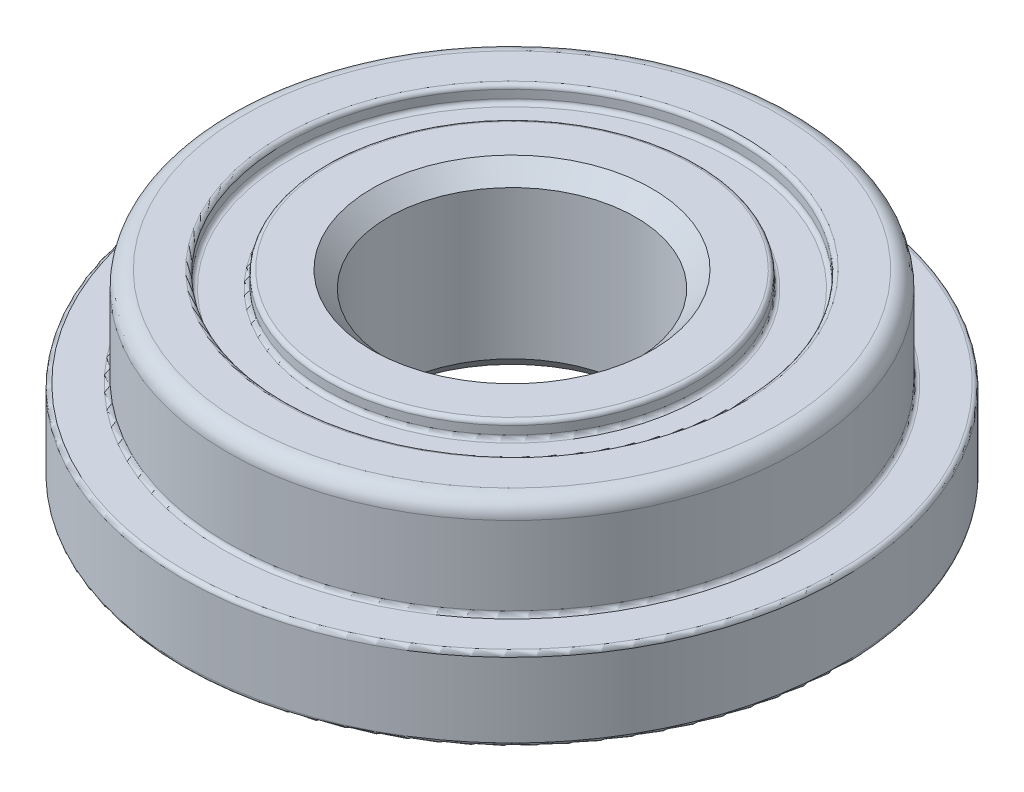
ISO-10303-21;
HEADER;
FILE_DESCRIPTION(('STEP AP214'),'2;1');
FILE_NAME('part.step','',(''),(''),'','','');
FILE_SCHEMA(('AUTOMOTIVE_DESIGN { 1 0 10303 214 1 1 1 1 }'));
ENDSEC;
DATA;
#1=APPLICATION_CONTEXT('core data for automotive mechanical design processes');
#2=APPLICATION_PROTOCOL_DEFINITION('international standard','automotive_design',2000,#1);
#3=PRODUCT_CONTEXT('',#1,'mechanical');
#4=PRODUCT('Part','Part','',(#3));
#5=PRODUCT_RELATED_PRODUCT_CATEGORY('part','',(#4));
#6=PRODUCT_DEFINITION_FORMATION('','',#4);
#7=PRODUCT_DEFINITION_CONTEXT('part definition',#1,'design');
#8=PRODUCT_DEFINITION('design','',#6,#7);
#9=PRODUCT_DEFINITION_SHAPE('','',#8);
#10=(LENGTH_UNIT() NAMED_UNIT(*) SI_UNIT(.MILLI.,.METRE.));
#11=(NAMED_UNIT(*) PLANE_ANGLE_UNIT() SI_UNIT($,.RADIAN.));
#12=(NAMED_UNIT(*) SI_UNIT($,.STERADIAN.) SOLID_ANGLE_UNIT());
#13=UNCERTAINTY_MEASURE_WITH_UNIT(LENGTH_MEASURE(1.E-05),#10,'distance_accuracy_value','');
#14=(GEOMETRIC_REPRESENTATION_CONTEXT(3) GLOBAL_UNCERTAINTY_ASSIGNED_CONTEXT((#13)) GLOBAL_UNIT_ASSIGNED_CONTEXT((#10,
#11,#12)) REPRESENTATION_CONTEXT('',''));
#15=CARTESIAN_POINT('',(0.,0.,0.));
#16=DIRECTION('',(0.,0.,1.));
#17=DIRECTION('',(1.,0.,0.));
#18=AXIS2_PLACEMENT_3D('',#15,#16,#17);
#19=CARTESIAN_POINT('',(0.,2.75,0.));
#20=DIRECTION('',(0.,1.,0.));
#21=DIRECTION('',(1.,0.,0.));
#22=AXIS2_PLACEMENT_3D('',#19,#20,#21);
#23=PLANE('',#22);
#24=CARTESIAN_POINT('',(0.,2.75,0.));
#25=DIRECTION('',(0.,-1.,0.));
#26=DIRECTION('',(0.,0.,1.));
#27=AXIS2_PLACEMENT_3D('',#24,#25,#26);
#28=CIRCLE('',#27,3.1625);
#29=CARTESIAN_POINT('',(0.,2.75,3.1625));
#30=VERTEX_POINT('',#29);
#31=EDGE_CURVE('E36',#30,#30,#28,.T.);
#32=ORIENTED_EDGE('',*,*,#31,.T.);
#33=EDGE_LOOP('',(#32));
#34=FACE_BOUND('',#33,.T.);
#35=CARTESIAN_POINT('',(0.,2.75,0.));
#36=DIRECTION('',(0.,1.,0.));
#37=DIRECTION('',(0.,0.,1.));
#38=AXIS2_PLACEMENT_3D('',#35,#36,#37);
#39=CIRCLE('',#38,3.7125);
#40=CARTESIAN_POINT('',(0.,2.75,3.7125));
#41=VERTEX_POINT('',#40);
#42=EDGE_CURVE('E110',#41,#41,#39,.T.);
#43=ORIENTED_EDGE('',*,*,#42,.T.);
#44=EDGE_LOOP('',(#43));
#45=FACE_BOUND('',#44,.T.);
#46=ADVANCED_FACE('F15',(#34,#45),#23,.T.);
#47=CARTESIAN_POINT('',(0.,3.025,0.));
#48=DIRECTION('',(0.,1.,0.));
#49=DIRECTION('',(1.,0.,0.));
#50=AXIS2_PLACEMENT_3D('',#47,#48,#49);
#51=PLANE('',#50);
#52=CARTESIAN_POINT('',(0.,3.025,0.));
#53=DIRECTION('',(0.,-1.,0.));
#54=DIRECTION('',(0.,0.,1.));
#55=AXIS2_PLACEMENT_3D('',#52,#53,#54);
#56=CIRCLE('',#55,3.85);
#57=CARTESIAN_POINT('',(0.,3.025,3.85));
#58=VERTEX_POINT('',#57);
#59=EDGE_CURVE('E96',#58,#58,#56,.T.);
#60=ORIENTED_EDGE('',*,*,#59,.T.);
#61=EDGE_LOOP('',(#60));
#62=FACE_BOUND('',#61,.T.);
#63=CARTESIAN_POINT('',(0.,3.025,0.));
#64=DIRECTION('',(0.,1.,0.));
#65=DIRECTION('',(0.,0.,1.));
#66=AXIS2_PLACEMENT_3D('',#63,#64,#65);
#67=CIRCLE('',#66,4.46875);
#68=CARTESIAN_POINT('',(0.,3.025,4.46875));
#69=VERTEX_POINT('',#68);
#70=EDGE_CURVE('E10',#69,#69,#67,.T.);
#71=ORIENTED_EDGE('',*,*,#70,.T.);
#72=EDGE_LOOP('',(#71));
#73=FACE_BOUND('',#72,.T.);
#74=ADVANCED_FACE('F17',(#62,#73),#51,.T.);
#75=CARTESIAN_POINT('',(0.,0.,0.));
#76=DIRECTION('',(0.,1.,0.));
#77=DIRECTION('',(1.,0.,0.));
#78=AXIS2_PLACEMENT_3D('',#75,#76,#77);
#79=PLANE('',#78);
#80=CARTESIAN_POINT('',(0.,0.,0.));
#81=DIRECTION('',(0.,1.,0.));
#82=DIRECTION('',(0.,0.,1.));
#83=AXIS2_PLACEMENT_3D('',#80,#81,#82);
#84=CIRCLE('',#83,2.3375);
#85=CARTESIAN_POINT('',(0.,0.,2.3375));
#86=VERTEX_POINT('',#85);
#87=EDGE_CURVE('E47',#86,#86,#84,.T.);
#88=ORIENTED_EDGE('',*,*,#87,.T.);
#89=EDGE_LOOP('',(#88));
#90=FACE_BOUND('',#89,.T.);
#91=CARTESIAN_POINT('',(0.,0.,0.));
#92=DIRECTION('',(0.,-1.,0.));
#93=DIRECTION('',(0.,0.,1.));
#94=AXIS2_PLACEMENT_3D('',#91,#92,#93);
#95=CIRCLE('',#94,5.43125);
#96=CARTESIAN_POINT('',(0.,0.,5.43125));
#97=VERTEX_POINT('',#96);
#98=EDGE_CURVE('E136',#97,#97,#95,.T.);
#99=ORIENTED_EDGE('',*,*,#98,.T.);
#100=EDGE_LOOP('',(#99));
#101=FACE_BOUND('',#100,.T.);
#102=ADVANCED_FACE('F143',(#90,#101),#79,.F.);
#103=CARTESIAN_POINT('',(0.,1.375,0.));
#104=DIRECTION('',(0.,1.,0.));
#105=DIRECTION('',(1.,0.,0.));
#106=AXIS2_PLACEMENT_3D('',#103,#104,#105);
#107=PLANE('',#106);
#108=CARTESIAN_POINT('',(0.,1.375,0.));
#109=DIRECTION('',(0.,-1.,0.));
#110=DIRECTION('',(0.,0.,1.));
#111=AXIS2_PLACEMENT_3D('',#108,#109,#110);
#112=CIRCLE('',#111,4.8125);
#113=CARTESIAN_POINT('',(0.,1.375,4.8125));
#114=VERTEX_POINT('',#113);
#115=EDGE_CURVE('E117',#114,#114,#112,.T.);
#116=ORIENTED_EDGE('',*,*,#115,.T.);
#117=EDGE_LOOP('',(#116));
#118=FACE_BOUND('',#117,.T.);
#119=CARTESIAN_POINT('',(0.,1.375,0.));
#120=DIRECTION('',(0.,1.,0.));
#121=DIRECTION('',(0.,0.,1.));
#122=AXIS2_PLACEMENT_3D('',#119,#120,#121);
#123=CIRCLE('',#122,5.43125);
#124=CARTESIAN_POINT('',(0.,1.375,5.43125));
#125=VERTEX_POINT('',#124);
#126=EDGE_CURVE('E116',#125,#125,#123,.T.);
#127=ORIENTED_EDGE('',*,*,#126,.T.);
#128=EDGE_LOOP('',(#127));
#129=FACE_BOUND('',#128,.T.);
#130=ADVANCED_FACE('F175',(#118,#129),#107,.T.);
#131=CARTESIAN_POINT('',(0.,3.025,0.));
#132=DIRECTION('',(0.,1.,0.));
#133=DIRECTION('',(1.,0.,0.));
#134=AXIS2_PLACEMENT_3D('',#131,#132,#133);
#135=PLANE('',#134);
#136=CARTESIAN_POINT('',(0.,3.025,0.));
#137=DIRECTION('',(0.,-1.,0.));
#138=DIRECTION('',(0.,0.,1.));
#139=AXIS2_PLACEMENT_3D('',#136,#137,#138);
#140=CIRCLE('',#139,2.3375);
#141=CARTESIAN_POINT('',(0.,3.025,2.3375));
#142=VERTEX_POINT('',#141);
#143=EDGE_CURVE('E33',#142,#142,#140,.T.);
#144=ORIENTED_EDGE('',*,*,#143,.T.);
#145=EDGE_LOOP('',(#144));
#146=FACE_BOUND('',#145,.T.);
#147=CARTESIAN_POINT('',(0.,3.025,0.));
#148=DIRECTION('',(0.,1.,0.));
#149=DIRECTION('',(0.,0.,1.));
#150=AXIS2_PLACEMENT_3D('',#147,#148,#149);
#151=CIRCLE('',#150,3.025);
#152=CARTESIAN_POINT('',(0.,3.025,3.025));
#153=VERTEX_POINT('',#152);
#154=EDGE_CURVE('E42',#153,#153,#151,.T.);
#155=ORIENTED_EDGE('',*,*,#154,.T.);
#156=EDGE_LOOP('',(#155));
#157=FACE_BOUND('',#156,.T.);
#158=ADVANCED_FACE('F60',(#146,#157),#135,.T.);
#159=CARTESIAN_POINT('',(0.,1.375,0.));
#160=DIRECTION('',(0.,-1.,0.));
#161=DIRECTION('',(0.,0.,-1.));
#162=AXIS2_PLACEMENT_3D('',#159,#160,#161);
#163=CYLINDRICAL_SURFACE('',#162,5.5);
#164=CARTESIAN_POINT('',(0.,0.06875,0.));
#165=DIRECTION('',(0.,1.,0.));
#166=DIRECTION('',(0.,0.,1.));
#167=AXIS2_PLACEMENT_3D('',#164,#165,#166);
#168=CIRCLE('',#167,5.5);
#169=CARTESIAN_POINT('',(0.,0.06875,5.5));
#170=VERTEX_POINT('',#169);
#171=EDGE_CURVE('E132',#170,#170,#168,.T.);
#172=ORIENTED_EDGE('',*,*,#171,.T.);
#173=EDGE_LOOP('',(#172));
#174=FACE_BOUND('',#173,.T.);
#175=CARTESIAN_POINT('',(0.,1.30625,0.));
#176=DIRECTION('',(0.,-1.,0.));
#177=DIRECTION('',(0.,0.,1.));
#178=AXIS2_PLACEMENT_3D('',#175,#176,#177);
#179=CIRCLE('',#178,5.5);
#180=CARTESIAN_POINT('',(0.,1.30625,5.5));
#181=VERTEX_POINT('',#180);
#182=EDGE_CURVE('E121',#181,#181,#179,.T.);
#183=ORIENTED_EDGE('',*,*,#182,.T.);
#184=EDGE_LOOP('',(#183));
#185=FACE_BOUND('',#184,.T.);
#186=ADVANCED_FACE('F171',(#174,#185),#163,.T.);
#187=CARTESIAN_POINT('',(0.,3.025,0.));
#188=DIRECTION('',(0.,-1.,0.));
#189=DIRECTION('',(0.,0.,-1.));
#190=AXIS2_PLACEMENT_3D('',#187,#188,#189);
#191=CYLINDRICAL_SURFACE('',#190,4.74375);
#192=CARTESIAN_POINT('',(0.,1.44375,0.));
#193=DIRECTION('',(0.,1.,0.));
#194=DIRECTION('',(0.,0.,1.));
#195=AXIS2_PLACEMENT_3D('',#192,#193,#194);
#196=CIRCLE('',#195,4.74375);
#197=CARTESIAN_POINT('',(0.,1.44375,4.74375));
#198=VERTEX_POINT('',#197);
#199=EDGE_CURVE('E122',#198,#198,#196,.T.);
#200=ORIENTED_EDGE('',*,*,#199,.T.);
#201=EDGE_LOOP('',(#200));
#202=FACE_BOUND('',#201,.T.);
#203=CARTESIAN_POINT('',(0.,2.75,0.));
#204=DIRECTION('',(0.,-1.,0.));
#205=DIRECTION('',(0.,0.,1.));
#206=AXIS2_PLACEMENT_3D('',#203,#204,#205);
#207=CIRCLE('',#206,4.74375);
#208=CARTESIAN_POINT('',(0.,2.75,4.74375));
#209=VERTEX_POINT('',#208);
#210=EDGE_CURVE('E19',#209,#209,#207,.T.);
#211=ORIENTED_EDGE('',*,*,#210,.T.);
#212=EDGE_LOOP('',(#211));
#213=FACE_BOUND('',#212,.T.);
#214=ADVANCED_FACE('F168',(#202,#213),#191,.T.);
#215=CARTESIAN_POINT('',(0.,2.75,0.));
#216=DIRECTION('',(0.,1.,0.));
#217=DIRECTION('',(0.,0.,1.));
#218=AXIS2_PLACEMENT_3D('',#215,#216,#217);
#219=TOROIDAL_SURFACE('',#218,4.46875,0.275);
#220=ORIENTED_EDGE('',*,*,#70,.F.);
#221=EDGE_LOOP('',(#220));
#222=FACE_BOUND('',#221,.T.);
#223=ORIENTED_EDGE('',*,*,#210,.F.);
#224=EDGE_LOOP('',(#223));
#225=FACE_BOUND('',#224,.T.);
#226=ADVANCED_FACE('F73',(#222,#225),#219,.T.);
#227=CARTESIAN_POINT('',(0.,0.,0.));
#228=DIRECTION('',(0.,1.,0.));
#229=DIRECTION('',(0.,0.,1.));
#230=AXIS2_PLACEMENT_3D('',#227,#228,#229);
#231=CYLINDRICAL_SURFACE('',#230,2.0625);
#232=CARTESIAN_POINT('',(0.,2.75,0.));
#233=DIRECTION('',(0.,1.,0.));
#234=DIRECTION('',(0.,0.,1.));
#235=AXIS2_PLACEMENT_3D('',#232,#233,#234);
#236=CIRCLE('',#235,2.0625);
#237=CARTESIAN_POINT('',(0.,2.75,2.0625));
#238=VERTEX_POINT('',#237);
#239=EDGE_CURVE('E51',#238,#238,#236,.T.);
#240=ORIENTED_EDGE('',*,*,#239,.T.);
#241=EDGE_LOOP('',(#240));
#242=FACE_BOUND('',#241,.T.);
#243=CARTESIAN_POINT('',(0.,0.275,0.));
#244=DIRECTION('',(0.,-1.,0.));
#245=DIRECTION('',(0.,0.,1.));
#246=AXIS2_PLACEMENT_3D('',#243,#244,#245);
#247=CIRCLE('',#246,2.0625);
#248=CARTESIAN_POINT('',(0.,0.275,2.0625));
#249=VERTEX_POINT('',#248);
#250=EDGE_CURVE('E46',#249,#249,#247,.T.);
#251=ORIENTED_EDGE('',*,*,#250,.T.);
#252=EDGE_LOOP('',(#251));
#253=FACE_BOUND('',#252,.T.);
#254=ADVANCED_FACE('F67',(#242,#253),#231,.F.);
#255=CARTESIAN_POINT('',(0.,2.75,0.));
#256=DIRECTION('',(0.,1.,0.));
#257=DIRECTION('',(0.,0.,1.));
#258=AXIS2_PLACEMENT_3D('',#255,#256,#257);
#259=CONICAL_SURFACE('',#258,2.0625,0.785398163397449);
#260=ORIENTED_EDGE('',*,*,#143,.F.);
#261=EDGE_LOOP('',(#260));
#262=FACE_BOUND('',#261,.T.);
#263=ORIENTED_EDGE('',*,*,#239,.F.);
#264=EDGE_LOOP('',(#263));
#265=FACE_BOUND('',#264,.T.);
#266=ADVANCED_FACE('F63',(#262,#265),#259,.F.);
#267=CARTESIAN_POINT('',(0.,0.,0.));
#268=DIRECTION('',(0.,-1.,0.));
#269=DIRECTION('',(0.,0.,-1.));
#270=AXIS2_PLACEMENT_3D('',#267,#268,#269);
#271=CONICAL_SURFACE('',#270,2.3375,0.785398163397448);
#272=ORIENTED_EDGE('',*,*,#87,.F.);
#273=EDGE_LOOP('',(#272));
#274=FACE_BOUND('',#273,.T.);
#275=ORIENTED_EDGE('',*,*,#250,.F.);
#276=EDGE_LOOP('',(#275));
#277=FACE_BOUND('',#276,.T.);
#278=ADVANCED_FACE('F66',(#274,#277),#271,.F.);
#279=CARTESIAN_POINT('',(0.,2.75,0.));
#280=DIRECTION('',(0.,1.,0.));
#281=DIRECTION('',(0.,0.,1.));
#282=AXIS2_PLACEMENT_3D('',#279,#280,#281);
#283=CYLINDRICAL_SURFACE('',#282,3.78125);
#284=CARTESIAN_POINT('',(0.,2.95625,0.));
#285=DIRECTION('',(0.,1.,0.));
#286=DIRECTION('',(0.,0.,1.));
#287=AXIS2_PLACEMENT_3D('',#284,#285,#286);
#288=CIRCLE('',#287,3.78125);
#289=CARTESIAN_POINT('',(0.,2.95625,3.78125));
#290=VERTEX_POINT('',#289);
#291=EDGE_CURVE('E83',#290,#290,#288,.T.);
#292=ORIENTED_EDGE('',*,*,#291,.T.);
#293=EDGE_LOOP('',(#292));
#294=FACE_BOUND('',#293,.T.);
#295=CARTESIAN_POINT('',(0.,2.81875,0.));
#296=DIRECTION('',(0.,-1.,0.));
#297=DIRECTION('',(0.,0.,1.));
#298=AXIS2_PLACEMENT_3D('',#295,#296,#297);
#299=CIRCLE('',#298,3.78125);
#300=CARTESIAN_POINT('',(0.,2.81875,3.78125));
#301=VERTEX_POINT('',#300);
#302=EDGE_CURVE('E103',#301,#301,#299,.T.);
#303=ORIENTED_EDGE('',*,*,#302,.T.);
#304=EDGE_LOOP('',(#303));
#305=FACE_BOUND('',#304,.T.);
#306=ADVANCED_FACE('F205',(#294,#305),#283,.F.);
#307=CARTESIAN_POINT('',(0.,2.75,0.));
#308=DIRECTION('',(0.,1.,0.));
#309=DIRECTION('',(0.,0.,1.));
#310=AXIS2_PLACEMENT_3D('',#307,#308,#309);
#311=CYLINDRICAL_SURFACE('',#310,3.09375);
#312=CARTESIAN_POINT('',(0.,2.95625,0.));
#313=DIRECTION('',(0.,-1.,0.));
#314=DIRECTION('',(0.,0.,1.));
#315=AXIS2_PLACEMENT_3D('',#312,#313,#314);
#316=CIRCLE('',#315,3.09375);
#317=CARTESIAN_POINT('',(0.,2.95625,3.09375));
#318=VERTEX_POINT('',#317);
#319=EDGE_CURVE('E38',#318,#318,#316,.T.);
#320=ORIENTED_EDGE('',*,*,#319,.T.);
#321=EDGE_LOOP('',(#320));
#322=FACE_BOUND('',#321,.T.);
#323=CARTESIAN_POINT('',(0.,2.81875,0.));
#324=DIRECTION('',(0.,1.,0.));
#325=DIRECTION('',(0.,0.,1.));
#326=AXIS2_PLACEMENT_3D('',#323,#324,#325);
#327=CIRCLE('',#326,3.09375);
#328=CARTESIAN_POINT('',(0.,2.81875,3.09375));
#329=VERTEX_POINT('',#328);
#330=EDGE_CURVE('E85',#329,#329,#327,.T.);
#331=ORIENTED_EDGE('',*,*,#330,.T.);
#332=EDGE_LOOP('',(#331));
#333=FACE_BOUND('',#332,.T.);
#334=ADVANCED_FACE('F214',(#322,#333),#311,.T.);
#335=CARTESIAN_POINT('',(0.,2.95625,0.));
#336=DIRECTION('',(0.,1.,0.));
#337=DIRECTION('',(0.,0.,1.));
#338=AXIS2_PLACEMENT_3D('',#335,#336,#337);
#339=TOROIDAL_SURFACE('',#338,3.025,0.06875);
#340=ORIENTED_EDGE('',*,*,#154,.F.);
#341=EDGE_LOOP('',(#340));
#342=FACE_BOUND('',#341,.T.);
#343=ORIENTED_EDGE('',*,*,#319,.F.);
#344=EDGE_LOOP('',(#343));
#345=FACE_BOUND('',#344,.T.);
#346=ADVANCED_FACE('F216',(#342,#345),#339,.T.);
#347=CARTESIAN_POINT('',(0.,2.81875,0.));
#348=DIRECTION('',(0.,1.,0.));
#349=DIRECTION('',(0.,0.,1.));
#350=AXIS2_PLACEMENT_3D('',#347,#348,#349);
#351=TOROIDAL_SURFACE('',#350,3.1625,0.06875);
#352=ORIENTED_EDGE('',*,*,#31,.F.);
#353=EDGE_LOOP('',(#352));
#354=FACE_BOUND('',#353,.T.);
#355=ORIENTED_EDGE('',*,*,#330,.F.);
#356=EDGE_LOOP('',(#355));
#357=FACE_BOUND('',#356,.T.);
#358=ADVANCED_FACE('F203',(#354,#357),#351,.F.);
#359=CARTESIAN_POINT('',(0.,2.95625,0.));
#360=DIRECTION('',(0.,1.,0.));
#361=DIRECTION('',(0.,0.,1.));
#362=AXIS2_PLACEMENT_3D('',#359,#360,#361);
#363=TOROIDAL_SURFACE('',#362,3.85,0.06875);
#364=ORIENTED_EDGE('',*,*,#291,.F.);
#365=EDGE_LOOP('',(#364));
#366=FACE_BOUND('',#365,.T.);
#367=ORIENTED_EDGE('',*,*,#59,.F.);
#368=EDGE_LOOP('',(#367));
#369=FACE_BOUND('',#368,.T.);
#370=ADVANCED_FACE('F198',(#366,#369),#363,.T.);
#371=CARTESIAN_POINT('',(0.,2.81875,0.));
#372=DIRECTION('',(0.,1.,0.));
#373=DIRECTION('',(0.,0.,1.));
#374=AXIS2_PLACEMENT_3D('',#371,#372,#373);
#375=TOROIDAL_SURFACE('',#374,3.7125,0.06875);
#376=ORIENTED_EDGE('',*,*,#302,.F.);
#377=EDGE_LOOP('',(#376));
#378=FACE_BOUND('',#377,.T.);
#379=ORIENTED_EDGE('',*,*,#42,.F.);
#380=EDGE_LOOP('',(#379));
#381=FACE_BOUND('',#380,.T.);
#382=ADVANCED_FACE('F191',(#378,#381),#375,.F.);
#383=CARTESIAN_POINT('',(0.,1.30625,0.));
#384=DIRECTION('',(0.,1.,0.));
#385=DIRECTION('',(0.,0.,1.));
#386=AXIS2_PLACEMENT_3D('',#383,#384,#385);
#387=TOROIDAL_SURFACE('',#386,5.43125,0.06875);
#388=ORIENTED_EDGE('',*,*,#126,.F.);
#389=EDGE_LOOP('',(#388));
#390=FACE_BOUND('',#389,.T.);
#391=ORIENTED_EDGE('',*,*,#182,.F.);
#392=EDGE_LOOP('',(#391));
#393=FACE_BOUND('',#392,.T.);
#394=ADVANCED_FACE('F154',(#390,#393),#387,.T.);
#395=CARTESIAN_POINT('',(0.,1.44375,0.));
#396=DIRECTION('',(0.,1.,0.));
#397=DIRECTION('',(0.,0.,1.));
#398=AXIS2_PLACEMENT_3D('',#395,#396,#397);
#399=TOROIDAL_SURFACE('',#398,4.8125,0.06875);
#400=ORIENTED_EDGE('',*,*,#115,.F.);
#401=EDGE_LOOP('',(#400));
#402=FACE_BOUND('',#401,.T.);
#403=ORIENTED_EDGE('',*,*,#199,.F.);
#404=EDGE_LOOP('',(#403));
#405=FACE_BOUND('',#404,.T.);
#406=ADVANCED_FACE('F147',(#402,#405),#399,.F.);
#407=CARTESIAN_POINT('',(0.,0.06875,0.));
#408=DIRECTION('',(0.,1.,0.));
#409=DIRECTION('',(0.,0.,1.));
#410=AXIS2_PLACEMENT_3D('',#407,#408,#409);
#411=TOROIDAL_SURFACE('',#410,5.43125,0.06875);
#412=ORIENTED_EDGE('',*,*,#171,.F.);
#413=EDGE_LOOP('',(#412));
#414=FACE_BOUND('',#413,.T.);
#415=ORIENTED_EDGE('',*,*,#98,.F.);
#416=EDGE_LOOP('',(#415));
#417=FACE_BOUND('',#416,.T.);
#418=ADVANCED_FACE('F145',(#414,#417),#411,.T.);
#419=CLOSED_SHELL('',(#46,#74,#102,#130,#158,#186,#214,#226,#254,#266,#278,#306,#334,#346,#358,
#370,#382,#394,#406,#418));
#420=MANIFOLD_SOLID_BREP('B1',#419);
#421=ADVANCED_BREP_SHAPE_REPRESENTATION('',(#18,#420),#14);
#422=SHAPE_DEFINITION_REPRESENTATION(#9,#421);
ENDSEC;
END-ISO-10303-21;
